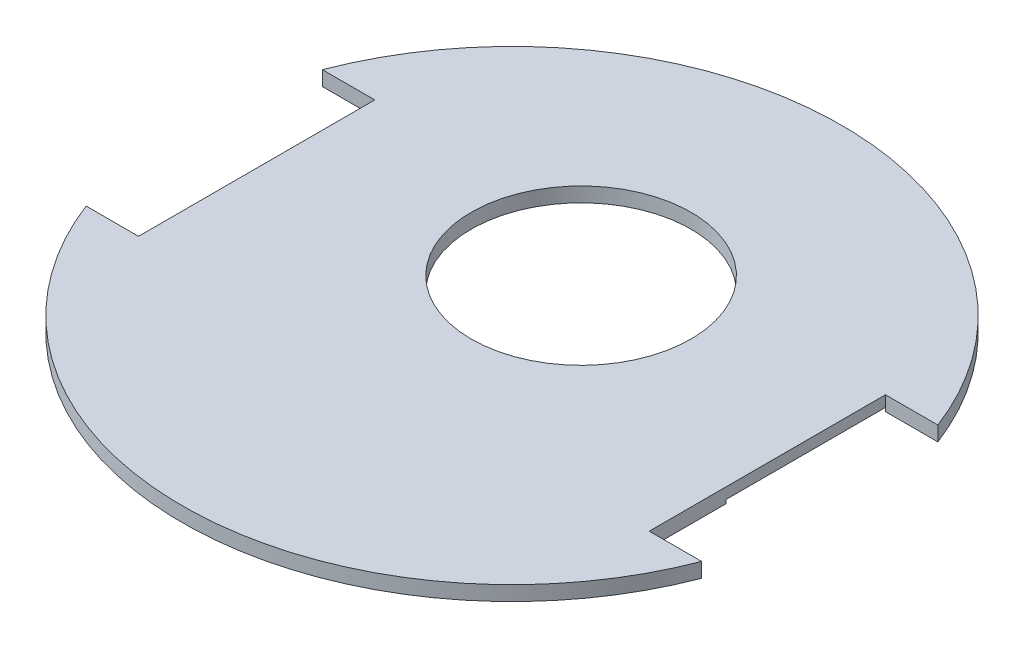
ISO-10303-21;
HEADER;
FILE_DESCRIPTION(('STEP AP214'),'2;1');
FILE_NAME('part.step','',(''),(''),'','','');
FILE_SCHEMA(('AUTOMOTIVE_DESIGN { 1 0 10303 214 1 1 1 1 }'));
ENDSEC;
DATA;
#1=APPLICATION_CONTEXT('core data for automotive mechanical design processes');
#2=APPLICATION_PROTOCOL_DEFINITION('international standard','automotive_design',2000,#1);
#3=PRODUCT_CONTEXT('',#1,'mechanical');
#4=PRODUCT('Part','Part','',(#3));
#5=PRODUCT_RELATED_PRODUCT_CATEGORY('part','',(#4));
#6=PRODUCT_DEFINITION_FORMATION('','',#4);
#7=PRODUCT_DEFINITION_CONTEXT('part definition',#1,'design');
#8=PRODUCT_DEFINITION('design','',#6,#7);
#9=PRODUCT_DEFINITION_SHAPE('','',#8);
#10=(LENGTH_UNIT() NAMED_UNIT(*) SI_UNIT(.MILLI.,.METRE.));
#11=(NAMED_UNIT(*) PLANE_ANGLE_UNIT() SI_UNIT($,.RADIAN.));
#12=(NAMED_UNIT(*) SI_UNIT($,.STERADIAN.) SOLID_ANGLE_UNIT());
#13=UNCERTAINTY_MEASURE_WITH_UNIT(LENGTH_MEASURE(1.E-05),#10,'distance_accuracy_value','');
#14=(GEOMETRIC_REPRESENTATION_CONTEXT(3) GLOBAL_UNCERTAINTY_ASSIGNED_CONTEXT((#13)) GLOBAL_UNIT_ASSIGNED_CONTEXT((#10,
#11,#12)) REPRESENTATION_CONTEXT('',''));
#15=CARTESIAN_POINT('',(0.,0.,0.));
#16=DIRECTION('',(0.,0.,1.));
#17=DIRECTION('',(1.,0.,0.));
#18=AXIS2_PLACEMENT_3D('',#15,#16,#17);
#19=CARTESIAN_POINT('',(0.,0.,0.));
#20=DIRECTION('',(0.,1.,0.));
#21=DIRECTION('',(0.,0.,1.));
#22=AXIS2_PLACEMENT_3D('',#19,#20,#21);
#23=PLANE('',#22);
#24=CARTESIAN_POINT('',(0.,0.,-71.5757942023211));
#25=DIRECTION('',(0.,1.,0.));
#26=DIRECTION('',(0.,0.,1.));
#27=AXIS2_PLACEMENT_3D('',#24,#25,#26);
#28=CIRCLE('',#27,17.5);
#29=CARTESIAN_POINT('',(0.,0.,-54.0757942023211));
#30=VERTEX_POINT('',#29);
#31=EDGE_CURVE('E37',#30,#30,#28,.F.);
#32=ORIENTED_EDGE('',*,*,#31,.F.);
#33=EDGE_LOOP('',(#32));
#34=FACE_BOUND('',#33,.T.);
#35=DIRECTION('',(-1.,0.,0.));
#36=VECTOR('',#35,1.);
#37=CARTESIAN_POINT('',(0.,0.,76.6948414935319));
#38=LINE('',#37,#36);
#39=CARTESIAN_POINT('',(37.85,0.,76.6948414935319));
#40=VERTEX_POINT('',#39);
#41=CARTESIAN_POINT('',(-37.85,0.,76.6948414935319));
#42=VERTEX_POINT('',#41);
#43=EDGE_CURVE('E341',#40,#42,#38,.T.);
#44=ORIENTED_EDGE('',*,*,#43,.F.);
#45=DIRECTION('',(0.,0.,-1.));
#46=VECTOR('',#45,1.);
#47=CARTESIAN_POINT('',(37.85,0.,0.));
#48=LINE('',#47,#46);
#49=CARTESIAN_POINT('',(37.85,0.,15.9948414935319));
#50=VERTEX_POINT('',#49);
#51=EDGE_CURVE('E11',#40,#50,#48,.T.);
#52=ORIENTED_EDGE('',*,*,#51,.T.);
#53=DIRECTION('',(-1.,0.,0.));
#54=VECTOR('',#53,1.);
#55=CARTESIAN_POINT('',(0.,0.,15.9948414935319));
#56=LINE('',#55,#54);
#57=CARTESIAN_POINT('',(-37.85,0.,15.9948414935319));
#58=VERTEX_POINT('',#57);
#59=EDGE_CURVE('E42',#50,#58,#56,.T.);
#60=ORIENTED_EDGE('',*,*,#59,.T.);
#61=DIRECTION('',(0.,0.,-1.));
#62=VECTOR('',#61,1.);
#63=CARTESIAN_POINT('',(-37.85,0.,0.));
#64=LINE('',#63,#62);
#65=EDGE_CURVE('E343',#42,#58,#64,.T.);
#66=ORIENTED_EDGE('',*,*,#65,.F.);
#67=EDGE_LOOP('',(#44,#52,#60,#66));
#68=FACE_BOUND('',#67,.T.);
#69=CARTESIAN_POINT('',(0.,0.,-18.8688433988716));
#70=DIRECTION('',(0.,1.,0.));
#71=DIRECTION('',(0.,0.,1.));
#72=AXIS2_PLACEMENT_3D('',#69,#70,#71);
#73=CIRCLE('',#72,30.);
#74=CARTESIAN_POINT('',(0.,0.,11.1311566011284));
#75=VERTEX_POINT('',#74);
#76=EDGE_CURVE('E185',#75,#75,#73,.T.);
#77=ORIENTED_EDGE('',*,*,#76,.T.);
#78=EDGE_LOOP('',(#77));
#79=FACE_BOUND('',#78,.T.);
#80=DIRECTION('',(0.,0.,-1.));
#81=VECTOR('',#80,1.);
#82=CARTESIAN_POINT('',(-69.7177169581654,0.,0.));
#83=LINE('',#82,#81);
#84=CARTESIAN_POINT('',(-69.7177169581654,0.,-32.25));
#85=VERTEX_POINT('',#84);
#86=CARTESIAN_POINT('',(-69.7177169581654,0.,-54.158982887466));
#87=VERTEX_POINT('',#86);
#88=EDGE_CURVE('E264',#85,#87,#83,.T.);
#89=ORIENTED_EDGE('',*,*,#88,.F.);
#90=DIRECTION('',(1.,0.,0.));
#91=VECTOR('',#90,1.);
#92=CARTESIAN_POINT('',(0.,0.,-32.25));
#93=LINE('',#92,#91);
#94=CARTESIAN_POINT('',(-84.0234342311715,0.,-32.25));
#95=VERTEX_POINT('',#94);
#96=EDGE_CURVE('E318',#95,#85,#93,.T.);
#97=ORIENTED_EDGE('',*,*,#96,.F.);
#98=CARTESIAN_POINT('',(0.,0.,0.));
#99=DIRECTION('',(0.,1.,0.));
#100=DIRECTION('',(0.,0.,1.));
#101=AXIS2_PLACEMENT_3D('',#98,#99,#100);
#102=CIRCLE('',#101,90.);
#103=CARTESIAN_POINT('',(84.0234342311715,0.,-32.25));
#104=VERTEX_POINT('',#103);
#105=EDGE_CURVE('E309',#104,#95,#102,.T.);
#106=ORIENTED_EDGE('',*,*,#105,.F.);
#107=DIRECTION('',(1.,0.,0.));
#108=VECTOR('',#107,1.);
#109=CARTESIAN_POINT('',(0.,0.,-32.25));
#110=LINE('',#109,#108);
#111=CARTESIAN_POINT('',(69.7177169581654,0.,-32.25));
#112=VERTEX_POINT('',#111);
#113=EDGE_CURVE('E321',#112,#104,#110,.T.);
#114=ORIENTED_EDGE('',*,*,#113,.F.);
#115=DIRECTION('',(0.,0.,-1.));
#116=VECTOR('',#115,1.);
#117=CARTESIAN_POINT('',(69.7177169581654,0.,0.));
#118=LINE('',#117,#116);
#119=CARTESIAN_POINT('',(69.7177169581654,0.,-54.158982887466));
#120=VERTEX_POINT('',#119);
#121=EDGE_CURVE('E236',#112,#120,#118,.T.);
#122=ORIENTED_EDGE('',*,*,#121,.T.);
#123=DIRECTION('',(1.,0.,0.));
#124=VECTOR('',#123,1.);
#125=CARTESIAN_POINT('',(0.,0.,-54.158982887466));
#126=LINE('',#125,#124);
#127=CARTESIAN_POINT('',(47.3177169581654,0.,-54.158982887466));
#128=VERTEX_POINT('',#127);
#129=EDGE_CURVE('E333',#128,#120,#126,.T.);
#130=ORIENTED_EDGE('',*,*,#129,.F.);
#131=DIRECTION('',(0.,0.,-1.));
#132=VECTOR('',#131,1.);
#133=CARTESIAN_POINT('',(47.3177169581654,0.,0.));
#134=LINE('',#133,#132);
#135=CARTESIAN_POINT('',(47.3177169581654,0.,11.341017112534));
#136=VERTEX_POINT('',#135);
#137=EDGE_CURVE('E331',#136,#128,#134,.T.);
#138=ORIENTED_EDGE('',*,*,#137,.F.);
#139=DIRECTION('',(1.,0.,0.));
#140=VECTOR('',#139,1.);
#141=CARTESIAN_POINT('',(0.,0.,11.341017112534));
#142=LINE('',#141,#140);
#143=CARTESIAN_POINT('',(69.7177169581654,0.,11.341017112534));
#144=VERTEX_POINT('',#143);
#145=EDGE_CURVE('E259',#136,#144,#142,.T.);
#146=ORIENTED_EDGE('',*,*,#145,.T.);
#147=DIRECTION('',(0.,0.,1.));
#148=VECTOR('',#147,1.);
#149=CARTESIAN_POINT('',(69.7177169581654,0.,0.));
#150=LINE('',#149,#148);
#151=CARTESIAN_POINT('',(69.7177169581654,0.,32.25));
#152=VERTEX_POINT('',#151);
#153=EDGE_CURVE('E323',#144,#152,#150,.T.);
#154=ORIENTED_EDGE('',*,*,#153,.T.);
#155=DIRECTION('',(1.,0.,0.));
#156=VECTOR('',#155,1.);
#157=CARTESIAN_POINT('',(0.,0.,32.25));
#158=LINE('',#157,#156);
#159=CARTESIAN_POINT('',(84.0234342311715,0.,32.25));
#160=VERTEX_POINT('',#159);
#161=EDGE_CURVE('E325',#152,#160,#158,.T.);
#162=ORIENTED_EDGE('',*,*,#161,.T.);
#163=CARTESIAN_POINT('',(-84.0234342311715,0.,32.25));
#164=VERTEX_POINT('',#163);
#165=EDGE_CURVE('E304',#164,#160,#102,.T.);
#166=ORIENTED_EDGE('',*,*,#165,.F.);
#167=DIRECTION('',(1.,0.,0.));
#168=VECTOR('',#167,1.);
#169=CARTESIAN_POINT('',(0.,0.,32.25));
#170=LINE('',#169,#168);
#171=CARTESIAN_POINT('',(-69.7177169581654,0.,32.25));
#172=VERTEX_POINT('',#171);
#173=EDGE_CURVE('E315',#164,#172,#170,.T.);
#174=ORIENTED_EDGE('',*,*,#173,.T.);
#175=DIRECTION('',(0.,0.,-1.));
#176=VECTOR('',#175,1.);
#177=CARTESIAN_POINT('',(-69.7177169581654,0.,0.));
#178=LINE('',#177,#176);
#179=CARTESIAN_POINT('',(-69.7177169581654,0.,11.341017112534));
#180=VERTEX_POINT('',#179);
#181=EDGE_CURVE('E312',#172,#180,#178,.T.);
#182=ORIENTED_EDGE('',*,*,#181,.T.);
#183=DIRECTION('',(-1.,0.,0.));
#184=VECTOR('',#183,1.);
#185=CARTESIAN_POINT('',(0.,0.,11.341017112534));
#186=LINE('',#185,#184);
#187=CARTESIAN_POINT('',(-47.3177169581654,0.,11.341017112534));
#188=VERTEX_POINT('',#187);
#189=EDGE_CURVE('E262',#188,#180,#186,.T.);
#190=ORIENTED_EDGE('',*,*,#189,.F.);
#191=DIRECTION('',(0.,0.,-1.));
#192=VECTOR('',#191,1.);
#193=CARTESIAN_POINT('',(-47.3177169581654,0.,0.));
#194=LINE('',#193,#192);
#195=CARTESIAN_POINT('',(-47.3177169581654,0.,-54.158982887466));
#196=VERTEX_POINT('',#195);
#197=EDGE_CURVE('E335',#188,#196,#194,.T.);
#198=ORIENTED_EDGE('',*,*,#197,.T.);
#199=DIRECTION('',(-1.,0.,0.));
#200=VECTOR('',#199,1.);
#201=CARTESIAN_POINT('',(0.,0.,-54.158982887466));
#202=LINE('',#201,#200);
#203=EDGE_CURVE('E338',#196,#87,#202,.T.);
#204=ORIENTED_EDGE('',*,*,#203,.T.);
#205=EDGE_LOOP('',(#89,#97,#106,#114,#122,#130,#138,#146,#154,#162,#166,#174,#182,#190,#198,#204));
#206=FACE_BOUND('',#205,.T.);
#207=ADVANCED_FACE('F33',(#34,#68,#79,#206),#23,.F.);
#208=CARTESIAN_POINT('',(-69.7177169581654,4.,0.));
#209=DIRECTION('',(1.,0.,0.));
#210=DIRECTION('',(0.,0.,-1.));
#211=AXIS2_PLACEMENT_3D('',#208,#209,#210);
#212=PLANE('',#211);
#213=DIRECTION('',(0.,-1.,0.));
#214=VECTOR('',#213,1.);
#215=CARTESIAN_POINT('',(-69.7177169581654,1.,11.341017112534));
#216=LINE('',#215,#214);
#217=CARTESIAN_POINT('',(-69.7177169581654,1.,11.341017112534));
#218=VERTEX_POINT('',#217);
#219=EDGE_CURVE('E230',#218,#180,#216,.T.);
#220=ORIENTED_EDGE('',*,*,#219,.T.);
#221=ORIENTED_EDGE('',*,*,#181,.F.);
#222=DIRECTION('',(0.,-1.,0.));
#223=VECTOR('',#222,1.);
#224=CARTESIAN_POINT('',(-69.7177169581654,4.,32.25));
#225=LINE('',#224,#223);
#226=CARTESIAN_POINT('',(-69.7177169581654,4.,32.25));
#227=VERTEX_POINT('',#226);
#228=EDGE_CURVE('E296',#227,#172,#225,.T.);
#229=ORIENTED_EDGE('',*,*,#228,.F.);
#230=DIRECTION('',(0.,0.,1.));
#231=VECTOR('',#230,1.);
#232=CARTESIAN_POINT('',(-69.7177169581654,4.,0.));
#233=LINE('',#232,#231);
#234=CARTESIAN_POINT('',(-69.7177169581654,4.,-32.25));
#235=VERTEX_POINT('',#234);
#236=EDGE_CURVE('E289',#235,#227,#233,.T.);
#237=ORIENTED_EDGE('',*,*,#236,.F.);
#238=DIRECTION('',(0.,-1.,0.));
#239=VECTOR('',#238,1.);
#240=CARTESIAN_POINT('',(-69.7177169581654,4.,-32.25));
#241=LINE('',#240,#239);
#242=CARTESIAN_POINT('',(-69.7177169581654,1.,-32.25));
#243=VERTEX_POINT('',#242);
#244=EDGE_CURVE('E293',#235,#243,#241,.T.);
#245=ORIENTED_EDGE('',*,*,#244,.T.);
#246=DIRECTION('',(0.,0.,1.));
#247=VECTOR('',#246,1.);
#248=CARTESIAN_POINT('',(-69.7177169581654,1.,0.));
#249=LINE('',#248,#247);
#250=EDGE_CURVE('E328',#243,#218,#249,.T.);
#251=ORIENTED_EDGE('',*,*,#250,.T.);
#252=EDGE_LOOP('',(#220,#221,#229,#237,#245,#251));
#253=FACE_BOUND('',#252,.T.);
#254=ADVANCED_FACE('F362',(#253),#212,.F.);
#255=CARTESIAN_POINT('',(0.,4.,0.));
#256=DIRECTION('',(0.,-1.,0.));
#257=DIRECTION('',(0.,0.,-1.));
#258=AXIS2_PLACEMENT_3D('',#255,#256,#257);
#259=CYLINDRICAL_SURFACE('',#258,90.);
#260=DIRECTION('',(0.,1.,0.));
#261=VECTOR('',#260,1.);
#262=CARTESIAN_POINT('',(84.0234342311715,-10.,-32.25));
#263=LINE('',#262,#261);
#264=CARTESIAN_POINT('',(84.0234342311715,4.,-32.25));
#265=VERTEX_POINT('',#264);
#266=EDGE_CURVE('E281',#104,#265,#263,.T.);
#267=ORIENTED_EDGE('',*,*,#266,.F.);
#268=ORIENTED_EDGE('',*,*,#105,.T.);
#269=DIRECTION('',(0.,-1.,0.));
#270=VECTOR('',#269,1.);
#271=CARTESIAN_POINT('',(-84.0234342311715,4.,-32.25));
#272=LINE('',#271,#270);
#273=CARTESIAN_POINT('',(-84.0234342311715,4.,-32.25));
#274=VERTEX_POINT('',#273);
#275=EDGE_CURVE('E302',#274,#95,#272,.T.);
#276=ORIENTED_EDGE('',*,*,#275,.F.);
#277=CARTESIAN_POINT('',(0.,4.,0.));
#278=DIRECTION('',(0.,1.,0.));
#279=DIRECTION('',(0.,0.,1.));
#280=AXIS2_PLACEMENT_3D('',#277,#278,#279);
#281=CIRCLE('',#280,90.);
#282=EDGE_CURVE('E308',#265,#274,#281,.T.);
#283=ORIENTED_EDGE('',*,*,#282,.F.);
#284=EDGE_LOOP('',(#267,#268,#276,#283));
#285=FACE_BOUND('',#284,.T.);
#286=ADVANCED_FACE('F35',(#285),#259,.T.);
#287=ORIENTED_EDGE('',*,*,#165,.T.);
#288=DIRECTION('',(0.,1.,0.));
#289=VECTOR('',#288,1.);
#290=CARTESIAN_POINT('',(84.0234342311715,-10.,32.25));
#291=LINE('',#290,#289);
#292=CARTESIAN_POINT('',(84.0234342311715,4.,32.25));
#293=VERTEX_POINT('',#292);
#294=EDGE_CURVE('E274',#160,#293,#291,.T.);
#295=ORIENTED_EDGE('',*,*,#294,.T.);
#296=CARTESIAN_POINT('',(-84.0234342311715,4.,32.25));
#297=VERTEX_POINT('',#296);
#298=EDGE_CURVE('E305',#297,#293,#281,.T.);
#299=ORIENTED_EDGE('',*,*,#298,.F.);
#300=DIRECTION('',(0.,-1.,0.));
#301=VECTOR('',#300,1.);
#302=CARTESIAN_POINT('',(-84.0234342311715,4.,32.25));
#303=LINE('',#302,#301);
#304=EDGE_CURVE('E299',#297,#164,#303,.T.);
#305=ORIENTED_EDGE('',*,*,#304,.T.);
#306=EDGE_LOOP('',(#287,#295,#299,#305));
#307=FACE_BOUND('',#306,.T.);
#308=ADVANCED_FACE('F375',(#307),#259,.T.);
#309=CARTESIAN_POINT('',(0.,4.,0.));
#310=DIRECTION('',(0.,1.,0.));
#311=DIRECTION('',(0.,0.,1.));
#312=AXIS2_PLACEMENT_3D('',#309,#310,#311);
#313=PLANE('',#312);
#314=CARTESIAN_POINT('',(0.,4.,-18.8688433988716));
#315=DIRECTION('',(0.,1.,0.));
#316=DIRECTION('',(0.,0.,1.));
#317=AXIS2_PLACEMENT_3D('',#314,#315,#316);
#318=CIRCLE('',#317,30.);
#319=CARTESIAN_POINT('',(0.,4.,11.1311566011284));
#320=VERTEX_POINT('',#319);
#321=EDGE_CURVE('E208',#320,#320,#318,.T.);
#322=ORIENTED_EDGE('',*,*,#321,.F.);
#323=EDGE_LOOP('',(#322));
#324=FACE_BOUND('',#323,.T.);
#325=DIRECTION('',(1.,0.,0.));
#326=VECTOR('',#325,1.);
#327=CARTESIAN_POINT('',(0.,4.,32.25));
#328=LINE('',#327,#326);
#329=CARTESIAN_POINT('',(69.7177169581654,4.,32.25));
#330=VERTEX_POINT('',#329);
#331=EDGE_CURVE('E266',#330,#293,#328,.T.);
#332=ORIENTED_EDGE('',*,*,#331,.F.);
#333=DIRECTION('',(0.,0.,1.));
#334=VECTOR('',#333,1.);
#335=CARTESIAN_POINT('',(69.7177169581654,4.,0.));
#336=LINE('',#335,#334);
#337=CARTESIAN_POINT('',(69.7177169581654,4.,-32.25));
#338=VERTEX_POINT('',#337);
#339=EDGE_CURVE('E271',#338,#330,#336,.T.);
#340=ORIENTED_EDGE('',*,*,#339,.F.);
#341=DIRECTION('',(1.,0.,0.));
#342=VECTOR('',#341,1.);
#343=CARTESIAN_POINT('',(0.,4.,-32.25));
#344=LINE('',#343,#342);
#345=EDGE_CURVE('E268',#338,#265,#344,.T.);
#346=ORIENTED_EDGE('',*,*,#345,.T.);
#347=ORIENTED_EDGE('',*,*,#282,.T.);
#348=DIRECTION('',(-1.,0.,0.));
#349=VECTOR('',#348,1.);
#350=CARTESIAN_POINT('',(0.,4.,-32.25));
#351=LINE('',#350,#349);
#352=EDGE_CURVE('E277',#235,#274,#351,.T.);
#353=ORIENTED_EDGE('',*,*,#352,.F.);
#354=ORIENTED_EDGE('',*,*,#236,.T.);
#355=DIRECTION('',(-1.,0.,0.));
#356=VECTOR('',#355,1.);
#357=CARTESIAN_POINT('',(0.,4.,32.25));
#358=LINE('',#357,#356);
#359=EDGE_CURVE('E286',#227,#297,#358,.T.);
#360=ORIENTED_EDGE('',*,*,#359,.T.);
#361=ORIENTED_EDGE('',*,*,#298,.T.);
#362=EDGE_LOOP('',(#332,#340,#346,#347,#353,#354,#360,#361));
#363=FACE_BOUND('',#362,.T.);
#364=ADVANCED_FACE('F371',(#324,#363),#313,.T.);
#365=CARTESIAN_POINT('',(0.,4.,-32.25));
#366=DIRECTION('',(0.,0.,1.));
#367=DIRECTION('',(1.,0.,0.));
#368=AXIS2_PLACEMENT_3D('',#365,#366,#367);
#369=PLANE('',#368);
#370=ORIENTED_EDGE('',*,*,#96,.T.);
#371=EDGE_CURVE('E292',#243,#85,#241,.T.);
#372=ORIENTED_EDGE('',*,*,#371,.F.);
#373=ORIENTED_EDGE('',*,*,#244,.F.);
#374=ORIENTED_EDGE('',*,*,#352,.T.);
#375=ORIENTED_EDGE('',*,*,#275,.T.);
#376=EDGE_LOOP('',(#370,#372,#373,#374,#375));
#377=FACE_BOUND('',#376,.T.);
#378=ADVANCED_FACE('F374',(#377),#369,.T.);
#379=CARTESIAN_POINT('',(0.,4.,32.25));
#380=DIRECTION('',(0.,0.,1.));
#381=DIRECTION('',(1.,0.,0.));
#382=AXIS2_PLACEMENT_3D('',#379,#380,#381);
#383=PLANE('',#382);
#384=ORIENTED_EDGE('',*,*,#304,.F.);
#385=ORIENTED_EDGE('',*,*,#359,.F.);
#386=ORIENTED_EDGE('',*,*,#228,.T.);
#387=ORIENTED_EDGE('',*,*,#173,.F.);
#388=EDGE_LOOP('',(#384,#385,#386,#387));
#389=FACE_BOUND('',#388,.T.);
#390=ADVANCED_FACE('F379',(#389),#383,.F.);
#391=CARTESIAN_POINT('',(0.,-10.,32.25));
#392=DIRECTION('',(0.,0.,1.));
#393=DIRECTION('',(1.,0.,0.));
#394=AXIS2_PLACEMENT_3D('',#391,#392,#393);
#395=PLANE('',#394);
#396=DIRECTION('',(0.,1.,0.));
#397=VECTOR('',#396,1.);
#398=CARTESIAN_POINT('',(69.7177169581654,-10.,32.25));
#399=LINE('',#398,#397);
#400=EDGE_CURVE('E275',#152,#330,#399,.T.);
#401=ORIENTED_EDGE('',*,*,#400,.T.);
#402=ORIENTED_EDGE('',*,*,#331,.T.);
#403=ORIENTED_EDGE('',*,*,#294,.F.);
#404=ORIENTED_EDGE('',*,*,#161,.F.);
#405=EDGE_LOOP('',(#401,#402,#403,#404));
#406=FACE_BOUND('',#405,.T.);
#407=ADVANCED_FACE('F382',(#406),#395,.F.);
#408=CARTESIAN_POINT('',(69.7177169581654,-10.,0.));
#409=DIRECTION('',(-1.,0.,0.));
#410=DIRECTION('',(0.,0.,1.));
#411=AXIS2_PLACEMENT_3D('',#408,#409,#410);
#412=PLANE('',#411);
#413=ORIENTED_EDGE('',*,*,#153,.F.);
#414=DIRECTION('',(0.,-1.,0.));
#415=VECTOR('',#414,1.);
#416=CARTESIAN_POINT('',(69.7177169581654,1.,11.341017112534));
#417=LINE('',#416,#415);
#418=CARTESIAN_POINT('',(69.7177169581654,1.,11.341017112534));
#419=VERTEX_POINT('',#418);
#420=EDGE_CURVE('E247',#419,#144,#417,.T.);
#421=ORIENTED_EDGE('',*,*,#420,.F.);
#422=DIRECTION('',(0.,0.,1.));
#423=VECTOR('',#422,1.);
#424=CARTESIAN_POINT('',(69.7177169581654,1.,0.));
#425=LINE('',#424,#423);
#426=CARTESIAN_POINT('',(69.7177169581654,1.,-32.25));
#427=VERTEX_POINT('',#426);
#428=EDGE_CURVE('E211',#427,#419,#425,.T.);
#429=ORIENTED_EDGE('',*,*,#428,.F.);
#430=DIRECTION('',(0.,1.,0.));
#431=VECTOR('',#430,1.);
#432=CARTESIAN_POINT('',(69.7177169581654,-10.,-32.25));
#433=LINE('',#432,#431);
#434=EDGE_CURVE('E280',#427,#338,#433,.T.);
#435=ORIENTED_EDGE('',*,*,#434,.T.);
#436=ORIENTED_EDGE('',*,*,#339,.T.);
#437=ORIENTED_EDGE('',*,*,#400,.F.);
#438=EDGE_LOOP('',(#413,#421,#429,#435,#436,#437));
#439=FACE_BOUND('',#438,.T.);
#440=ADVANCED_FACE('F387',(#439),#412,.F.);
#441=CARTESIAN_POINT('',(0.,-10.,-32.25));
#442=DIRECTION('',(0.,0.,1.));
#443=DIRECTION('',(1.,0.,0.));
#444=AXIS2_PLACEMENT_3D('',#441,#442,#443);
#445=PLANE('',#444);
#446=ORIENTED_EDGE('',*,*,#113,.T.);
#447=ORIENTED_EDGE('',*,*,#266,.T.);
#448=ORIENTED_EDGE('',*,*,#345,.F.);
#449=ORIENTED_EDGE('',*,*,#434,.F.);
#450=EDGE_CURVE('E278',#112,#427,#433,.T.);
#451=ORIENTED_EDGE('',*,*,#450,.F.);
#452=EDGE_LOOP('',(#446,#447,#448,#449,#451));
#453=FACE_BOUND('',#452,.T.);
#454=ADVANCED_FACE('F389',(#453),#445,.T.);
#455=CARTESIAN_POINT('',(0.,1.,-54.158982887466));
#456=DIRECTION('',(0.,0.,1.));
#457=DIRECTION('',(1.,0.,0.));
#458=AXIS2_PLACEMENT_3D('',#455,#456,#457);
#459=PLANE('',#458);
#460=ORIENTED_EDGE('',*,*,#129,.T.);
#461=DIRECTION('',(0.,-1.,0.));
#462=VECTOR('',#461,1.);
#463=CARTESIAN_POINT('',(69.7177169581654,1.,-54.158982887466));
#464=LINE('',#463,#462);
#465=CARTESIAN_POINT('',(69.7177169581654,1.,-54.158982887466));
#466=VERTEX_POINT('',#465);
#467=EDGE_CURVE('E218',#466,#120,#464,.T.);
#468=ORIENTED_EDGE('',*,*,#467,.F.);
#469=DIRECTION('',(-1.,0.,0.));
#470=VECTOR('',#469,1.);
#471=CARTESIAN_POINT('',(0.,1.,-54.158982887466));
#472=LINE('',#471,#470);
#473=CARTESIAN_POINT('',(47.3177169581654,1.,-54.158982887466));
#474=VERTEX_POINT('',#473);
#475=EDGE_CURVE('E240',#466,#474,#472,.T.);
#476=ORIENTED_EDGE('',*,*,#475,.T.);
#477=DIRECTION('',(0.,-1.,0.));
#478=VECTOR('',#477,1.);
#479=CARTESIAN_POINT('',(47.3177169581654,1.,-54.158982887466));
#480=LINE('',#479,#478);
#481=EDGE_CURVE('E252',#474,#128,#480,.T.);
#482=ORIENTED_EDGE('',*,*,#481,.T.);
#483=EDGE_LOOP('',(#460,#468,#476,#482));
#484=FACE_BOUND('',#483,.T.);
#485=ADVANCED_FACE('F392',(#484),#459,.T.);
#486=CARTESIAN_POINT('',(47.3177169581654,1.,0.));
#487=DIRECTION('',(1.,0.,0.));
#488=DIRECTION('',(0.,0.,-1.));
#489=AXIS2_PLACEMENT_3D('',#486,#487,#488);
#490=PLANE('',#489);
#491=ORIENTED_EDGE('',*,*,#137,.T.);
#492=ORIENTED_EDGE('',*,*,#481,.F.);
#493=DIRECTION('',(0.,0.,1.));
#494=VECTOR('',#493,1.);
#495=CARTESIAN_POINT('',(47.3177169581654,1.,0.));
#496=LINE('',#495,#494);
#497=CARTESIAN_POINT('',(47.3177169581654,1.,11.341017112534));
#498=VERTEX_POINT('',#497);
#499=EDGE_CURVE('E242',#474,#498,#496,.T.);
#500=ORIENTED_EDGE('',*,*,#499,.T.);
#501=DIRECTION('',(0.,-1.,0.));
#502=VECTOR('',#501,1.);
#503=CARTESIAN_POINT('',(47.3177169581654,1.,11.341017112534));
#504=LINE('',#503,#502);
#505=EDGE_CURVE('E249',#498,#136,#504,.T.);
#506=ORIENTED_EDGE('',*,*,#505,.T.);
#507=EDGE_LOOP('',(#491,#492,#500,#506));
#508=FACE_BOUND('',#507,.T.);
#509=ADVANCED_FACE('F405',(#508),#490,.T.);
#510=CARTESIAN_POINT('',(0.,1.,11.341017112534));
#511=DIRECTION('',(0.,0.,1.));
#512=DIRECTION('',(1.,0.,0.));
#513=AXIS2_PLACEMENT_3D('',#510,#511,#512);
#514=PLANE('',#513);
#515=ORIENTED_EDGE('',*,*,#505,.F.);
#516=DIRECTION('',(-1.,0.,0.));
#517=VECTOR('',#516,1.);
#518=CARTESIAN_POINT('',(0.,1.,11.341017112534));
#519=LINE('',#518,#517);
#520=EDGE_CURVE('E244',#419,#498,#519,.T.);
#521=ORIENTED_EDGE('',*,*,#520,.F.);
#522=ORIENTED_EDGE('',*,*,#420,.T.);
#523=ORIENTED_EDGE('',*,*,#145,.F.);
#524=EDGE_LOOP('',(#515,#521,#522,#523));
#525=FACE_BOUND('',#524,.T.);
#526=ADVANCED_FACE('F401',(#525),#514,.F.);
#527=CARTESIAN_POINT('',(69.7177169581654,1.,0.));
#528=DIRECTION('',(1.,0.,0.));
#529=DIRECTION('',(0.,0.,-1.));
#530=AXIS2_PLACEMENT_3D('',#527,#528,#529);
#531=PLANE('',#530);
#532=ORIENTED_EDGE('',*,*,#450,.T.);
#533=EDGE_CURVE('E237',#466,#427,#425,.T.);
#534=ORIENTED_EDGE('',*,*,#533,.F.);
#535=ORIENTED_EDGE('',*,*,#467,.T.);
#536=ORIENTED_EDGE('',*,*,#121,.F.);
#537=EDGE_LOOP('',(#532,#534,#535,#536));
#538=FACE_BOUND('',#537,.T.);
#539=ADVANCED_FACE('F397',(#538),#531,.F.);
#540=CARTESIAN_POINT('',(0.,1.,0.));
#541=DIRECTION('',(0.,1.,0.));
#542=DIRECTION('',(0.,0.,1.));
#543=AXIS2_PLACEMENT_3D('',#540,#541,#542);
#544=PLANE('',#543);
#545=ORIENTED_EDGE('',*,*,#533,.T.);
#546=ORIENTED_EDGE('',*,*,#428,.T.);
#547=ORIENTED_EDGE('',*,*,#520,.T.);
#548=ORIENTED_EDGE('',*,*,#499,.F.);
#549=ORIENTED_EDGE('',*,*,#475,.F.);
#550=EDGE_LOOP('',(#545,#546,#547,#548,#549));
#551=FACE_BOUND('',#550,.T.);
#552=ADVANCED_FACE('F400',(#551),#544,.F.);
#553=CARTESIAN_POINT('',(0.,1.,-54.158982887466));
#554=DIRECTION('',(0.,0.,-1.));
#555=DIRECTION('',(-1.,0.,0.));
#556=AXIS2_PLACEMENT_3D('',#553,#554,#555);
#557=PLANE('',#556);
#558=DIRECTION('',(0.,-1.,0.));
#559=VECTOR('',#558,1.);
#560=CARTESIAN_POINT('',(-47.3177169581654,1.,-54.158982887466));
#561=LINE('',#560,#559);
#562=CARTESIAN_POINT('',(-47.3177169581654,1.,-54.158982887466));
#563=VERTEX_POINT('',#562);
#564=EDGE_CURVE('E224',#563,#196,#561,.T.);
#565=ORIENTED_EDGE('',*,*,#564,.F.);
#566=DIRECTION('',(1.,0.,0.));
#567=VECTOR('',#566,1.);
#568=CARTESIAN_POINT('',(0.,1.,-54.158982887466));
#569=LINE('',#568,#567);
#570=CARTESIAN_POINT('',(-69.7177169581654,1.,-54.158982887466));
#571=VERTEX_POINT('',#570);
#572=EDGE_CURVE('E214',#571,#563,#569,.T.);
#573=ORIENTED_EDGE('',*,*,#572,.F.);
#574=DIRECTION('',(0.,-1.,0.));
#575=VECTOR('',#574,1.);
#576=CARTESIAN_POINT('',(-69.7177169581654,1.,-54.158982887466));
#577=LINE('',#576,#575);
#578=EDGE_CURVE('E233',#571,#87,#577,.T.);
#579=ORIENTED_EDGE('',*,*,#578,.T.);
#580=ORIENTED_EDGE('',*,*,#203,.F.);
#581=EDGE_LOOP('',(#565,#573,#579,#580));
#582=FACE_BOUND('',#581,.T.);
#583=ADVANCED_FACE('F415',(#582),#557,.F.);
#584=CARTESIAN_POINT('',(-47.3177169581654,1.,0.));
#585=DIRECTION('',(1.,0.,0.));
#586=DIRECTION('',(0.,0.,-1.));
#587=AXIS2_PLACEMENT_3D('',#584,#585,#586);
#588=PLANE('',#587);
#589=DIRECTION('',(0.,-1.,0.));
#590=VECTOR('',#589,1.);
#591=CARTESIAN_POINT('',(-47.3177169581654,1.,11.341017112534));
#592=LINE('',#591,#590);
#593=CARTESIAN_POINT('',(-47.3177169581654,1.,11.341017112534));
#594=VERTEX_POINT('',#593);
#595=EDGE_CURVE('E227',#594,#188,#592,.T.);
#596=ORIENTED_EDGE('',*,*,#595,.F.);
#597=DIRECTION('',(0.,0.,1.));
#598=VECTOR('',#597,1.);
#599=CARTESIAN_POINT('',(-47.3177169581654,1.,0.));
#600=LINE('',#599,#598);
#601=EDGE_CURVE('E222',#563,#594,#600,.T.);
#602=ORIENTED_EDGE('',*,*,#601,.F.);
#603=ORIENTED_EDGE('',*,*,#564,.T.);
#604=ORIENTED_EDGE('',*,*,#197,.F.);
#605=EDGE_LOOP('',(#596,#602,#603,#604));
#606=FACE_BOUND('',#605,.T.);
#607=ADVANCED_FACE('F419',(#606),#588,.F.);
#608=CARTESIAN_POINT('',(-69.7177169581654,1.,0.));
#609=DIRECTION('',(1.,0.,0.));
#610=DIRECTION('',(0.,0.,-1.));
#611=AXIS2_PLACEMENT_3D('',#608,#609,#610);
#612=PLANE('',#611);
#613=ORIENTED_EDGE('',*,*,#88,.T.);
#614=ORIENTED_EDGE('',*,*,#578,.F.);
#615=DIRECTION('',(0.,0.,1.));
#616=VECTOR('',#615,1.);
#617=CARTESIAN_POINT('',(-69.7177169581654,1.,0.));
#618=LINE('',#617,#616);
#619=EDGE_CURVE('E217',#571,#243,#618,.T.);
#620=ORIENTED_EDGE('',*,*,#619,.T.);
#621=ORIENTED_EDGE('',*,*,#371,.T.);
#622=EDGE_LOOP('',(#613,#614,#620,#621));
#623=FACE_BOUND('',#622,.T.);
#624=ADVANCED_FACE('F421',(#623),#612,.T.);
#625=CARTESIAN_POINT('',(0.,1.,11.341017112534));
#626=DIRECTION('',(0.,0.,-1.));
#627=DIRECTION('',(-1.,0.,0.));
#628=AXIS2_PLACEMENT_3D('',#625,#626,#627);
#629=PLANE('',#628);
#630=ORIENTED_EDGE('',*,*,#189,.T.);
#631=ORIENTED_EDGE('',*,*,#219,.F.);
#632=DIRECTION('',(1.,0.,0.));
#633=VECTOR('',#632,1.);
#634=CARTESIAN_POINT('',(0.,1.,11.341017112534));
#635=LINE('',#634,#633);
#636=EDGE_CURVE('E57',#218,#594,#635,.T.);
#637=ORIENTED_EDGE('',*,*,#636,.T.);
#638=ORIENTED_EDGE('',*,*,#595,.T.);
#639=EDGE_LOOP('',(#630,#631,#637,#638));
#640=FACE_BOUND('',#639,.T.);
#641=ADVANCED_FACE('F424',(#640),#629,.T.);
#642=CARTESIAN_POINT('',(0.,1.,0.));
#643=DIRECTION('',(0.,1.,0.));
#644=DIRECTION('',(0.,0.,1.));
#645=AXIS2_PLACEMENT_3D('',#642,#643,#644);
#646=PLANE('',#645);
#647=ORIENTED_EDGE('',*,*,#572,.T.);
#648=ORIENTED_EDGE('',*,*,#601,.T.);
#649=ORIENTED_EDGE('',*,*,#636,.F.);
#650=ORIENTED_EDGE('',*,*,#250,.F.);
#651=ORIENTED_EDGE('',*,*,#619,.F.);
#652=EDGE_LOOP('',(#647,#648,#649,#650,#651));
#653=FACE_BOUND('',#652,.T.);
#654=ADVANCED_FACE('F428',(#653),#646,.F.);
#655=CARTESIAN_POINT('',(0.,4.,-18.8688433988716));
#656=DIRECTION('',(0.,-1.,0.));
#657=DIRECTION('',(0.,0.,-1.));
#658=AXIS2_PLACEMENT_3D('',#655,#656,#657);
#659=CYLINDRICAL_SURFACE('',#658,30.);
#660=ORIENTED_EDGE('',*,*,#321,.T.);
#661=EDGE_LOOP('',(#660));
#662=FACE_BOUND('',#661,.T.);
#663=ORIENTED_EDGE('',*,*,#76,.F.);
#664=EDGE_LOOP('',(#663));
#665=FACE_BOUND('',#664,.T.);
#666=ADVANCED_FACE('F435',(#662,#665),#659,.F.);
#667=CARTESIAN_POINT('',(37.85,1.,0.));
#668=DIRECTION('',(1.,0.,0.));
#669=DIRECTION('',(0.,0.,-1.));
#670=AXIS2_PLACEMENT_3D('',#667,#668,#669);
#671=PLANE('',#670);
#672=DIRECTION('',(0.,-1.,0.));
#673=VECTOR('',#672,1.);
#674=CARTESIAN_POINT('',(37.85,1.,76.6948414935319));
#675=LINE('',#674,#673);
#676=CARTESIAN_POINT('',(37.85,1.,76.6948414935319));
#677=VERTEX_POINT('',#676);
#678=EDGE_CURVE('E49',#677,#40,#675,.T.);
#679=ORIENTED_EDGE('',*,*,#678,.F.);
#680=DIRECTION('',(0.,0.,1.));
#681=VECTOR('',#680,1.);
#682=CARTESIAN_POINT('',(37.85,1.,0.));
#683=LINE('',#682,#681);
#684=CARTESIAN_POINT('',(37.85,1.,15.9948414935319));
#685=VERTEX_POINT('',#684);
#686=EDGE_CURVE('E189',#685,#677,#683,.T.);
#687=ORIENTED_EDGE('',*,*,#686,.F.);
#688=DIRECTION('',(0.,-1.,0.));
#689=VECTOR('',#688,1.);
#690=CARTESIAN_POINT('',(37.85,1.,15.9948414935319));
#691=LINE('',#690,#689);
#692=EDGE_CURVE('E177',#685,#50,#691,.T.);
#693=ORIENTED_EDGE('',*,*,#692,.T.);
#694=ORIENTED_EDGE('',*,*,#51,.F.);
#695=EDGE_LOOP('',(#679,#687,#693,#694));
#696=FACE_BOUND('',#695,.T.);
#697=ADVANCED_FACE('F190',(#696),#671,.F.);
#698=CARTESIAN_POINT('',(0.,1.,15.9948414935319));
#699=DIRECTION('',(0.,0.,-1.));
#700=DIRECTION('',(-1.,0.,0.));
#701=AXIS2_PLACEMENT_3D('',#698,#699,#700);
#702=PLANE('',#701);
#703=ORIENTED_EDGE('',*,*,#692,.F.);
#704=DIRECTION('',(1.,0.,0.));
#705=VECTOR('',#704,1.);
#706=CARTESIAN_POINT('',(0.,1.,15.9948414935319));
#707=LINE('',#706,#705);
#708=CARTESIAN_POINT('',(-37.85,1.,15.9948414935319));
#709=VERTEX_POINT('',#708);
#710=EDGE_CURVE('E182',#709,#685,#707,.T.);
#711=ORIENTED_EDGE('',*,*,#710,.F.);
#712=DIRECTION('',(0.,-1.,0.));
#713=VECTOR('',#712,1.);
#714=CARTESIAN_POINT('',(-37.85,1.,15.9948414935319));
#715=LINE('',#714,#713);
#716=EDGE_CURVE('E186',#709,#58,#715,.T.);
#717=ORIENTED_EDGE('',*,*,#716,.T.);
#718=ORIENTED_EDGE('',*,*,#59,.F.);
#719=EDGE_LOOP('',(#703,#711,#717,#718));
#720=FACE_BOUND('',#719,.T.);
#721=ADVANCED_FACE('F179',(#720),#702,.F.);
#722=CARTESIAN_POINT('',(-37.85,1.,0.));
#723=DIRECTION('',(1.,0.,0.));
#724=DIRECTION('',(0.,0.,-1.));
#725=AXIS2_PLACEMENT_3D('',#722,#723,#724);
#726=PLANE('',#725);
#727=ORIENTED_EDGE('',*,*,#65,.T.);
#728=ORIENTED_EDGE('',*,*,#716,.F.);
#729=DIRECTION('',(0.,0.,1.));
#730=VECTOR('',#729,1.);
#731=CARTESIAN_POINT('',(-37.85,1.,0.));
#732=LINE('',#731,#730);
#733=CARTESIAN_POINT('',(-37.85,1.,76.6948414935319));
#734=VERTEX_POINT('',#733);
#735=EDGE_CURVE('E196',#709,#734,#732,.T.);
#736=ORIENTED_EDGE('',*,*,#735,.T.);
#737=DIRECTION('',(0.,-1.,0.));
#738=VECTOR('',#737,1.);
#739=CARTESIAN_POINT('',(-37.85,1.,76.6948414935319));
#740=LINE('',#739,#738);
#741=EDGE_CURVE('E204',#734,#42,#740,.T.);
#742=ORIENTED_EDGE('',*,*,#741,.T.);
#743=EDGE_LOOP('',(#727,#728,#736,#742));
#744=FACE_BOUND('',#743,.T.);
#745=ADVANCED_FACE('F352',(#744),#726,.T.);
#746=CARTESIAN_POINT('',(0.,1.,76.6948414935319));
#747=DIRECTION('',(0.,0.,-1.));
#748=DIRECTION('',(-1.,0.,0.));
#749=AXIS2_PLACEMENT_3D('',#746,#747,#748);
#750=PLANE('',#749);
#751=ORIENTED_EDGE('',*,*,#43,.T.);
#752=ORIENTED_EDGE('',*,*,#741,.F.);
#753=DIRECTION('',(1.,0.,0.));
#754=VECTOR('',#753,1.);
#755=CARTESIAN_POINT('',(0.,1.,76.6948414935319));
#756=LINE('',#755,#754);
#757=EDGE_CURVE('E198',#734,#677,#756,.T.);
#758=ORIENTED_EDGE('',*,*,#757,.T.);
#759=ORIENTED_EDGE('',*,*,#678,.T.);
#760=EDGE_LOOP('',(#751,#752,#758,#759));
#761=FACE_BOUND('',#760,.T.);
#762=ADVANCED_FACE('F350',(#761),#750,.T.);
#763=CARTESIAN_POINT('',(0.,1.,0.));
#764=DIRECTION('',(0.,1.,0.));
#765=DIRECTION('',(0.,0.,1.));
#766=AXIS2_PLACEMENT_3D('',#763,#764,#765);
#767=PLANE('',#766);
#768=ORIENTED_EDGE('',*,*,#686,.T.);
#769=ORIENTED_EDGE('',*,*,#757,.F.);
#770=ORIENTED_EDGE('',*,*,#735,.F.);
#771=ORIENTED_EDGE('',*,*,#710,.T.);
#772=EDGE_LOOP('',(#768,#769,#770,#771));
#773=FACE_BOUND('',#772,.T.);
#774=ADVANCED_FACE('F195',(#773),#767,.F.);
#775=CARTESIAN_POINT('',(0.,1.,-71.5757942023211));
#776=DIRECTION('',(0.,-1.,0.));
#777=DIRECTION('',(0.,0.,-1.));
#778=AXIS2_PLACEMENT_3D('',#775,#776,#777);
#779=CYLINDRICAL_SURFACE('',#778,17.5);
#780=CARTESIAN_POINT('',(0.,1.,-71.5757942023211));
#781=DIRECTION('',(0.,1.,0.));
#782=DIRECTION('',(0.,0.,1.));
#783=AXIS2_PLACEMENT_3D('',#780,#781,#782);
#784=CIRCLE('',#783,17.5);
#785=CARTESIAN_POINT('',(0.,1.,-54.0757942023211));
#786=VERTEX_POINT('',#785);
#787=EDGE_CURVE('E498',#786,#786,#784,.T.);
#788=ORIENTED_EDGE('',*,*,#787,.T.);
#789=EDGE_LOOP('',(#788));
#790=FACE_BOUND('',#789,.T.);
#791=ORIENTED_EDGE('',*,*,#31,.T.);
#792=EDGE_LOOP('',(#791));
#793=FACE_BOUND('',#792,.T.);
#794=ADVANCED_FACE('F466',(#790,#793),#779,.F.);
#795=CARTESIAN_POINT('',(0.,1.,-71.5757942023211));
#796=DIRECTION('',(0.,1.,0.));
#797=DIRECTION('',(0.,0.,1.));
#798=AXIS2_PLACEMENT_3D('',#795,#796,#797);
#799=PLANE('',#798);
#800=ORIENTED_EDGE('',*,*,#787,.F.);
#801=EDGE_LOOP('',(#800));
#802=FACE_BOUND('',#801,.T.);
#803=ADVANCED_FACE('F482',(#802),#799,.F.);
#804=CLOSED_SHELL('',(#207,#254,#286,#308,#364,#378,#390,#407,#440,#454,#485,#509,#526,#539,
#552,#583,#607,#624,#641,#654,#666,#697,#721,#745,#762,#774,#794,#803));
#805=MANIFOLD_SOLID_BREP('B2',#804);
#806=ADVANCED_BREP_SHAPE_REPRESENTATION('',(#18,#805),#14);
#807=SHAPE_DEFINITION_REPRESENTATION(#9,#806);
ENDSEC;
END-ISO-10303-21;
